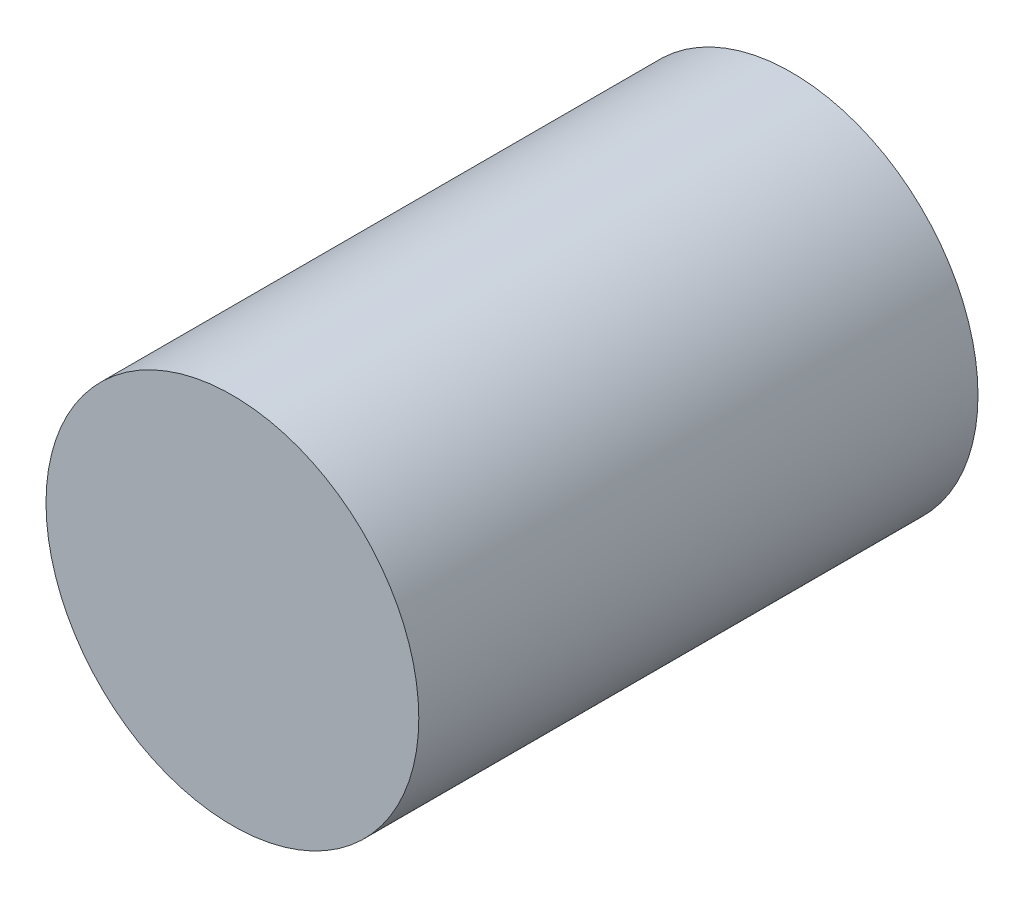
ISO-10303-21;
HEADER;
FILE_DESCRIPTION(('STEP AP214'),'2;1');
FILE_NAME('part.step','',(''),(''),'','','');
FILE_SCHEMA(('AUTOMOTIVE_DESIGN { 1 0 10303 214 1 1 1 1 }'));
ENDSEC;
DATA;
#1=APPLICATION_CONTEXT('core data for automotive mechanical design processes');
#2=APPLICATION_PROTOCOL_DEFINITION('international standard','automotive_design',2000,#1);
#3=PRODUCT_CONTEXT('',#1,'mechanical');
#4=PRODUCT('Part','Part','',(#3));
#5=PRODUCT_RELATED_PRODUCT_CATEGORY('part','',(#4));
#6=PRODUCT_DEFINITION_FORMATION('','',#4);
#7=PRODUCT_DEFINITION_CONTEXT('part definition',#1,'design');
#8=PRODUCT_DEFINITION('design','',#6,#7);
#9=PRODUCT_DEFINITION_SHAPE('','',#8);
#10=(LENGTH_UNIT() NAMED_UNIT(*) SI_UNIT(.MILLI.,.METRE.));
#11=(NAMED_UNIT(*) PLANE_ANGLE_UNIT() SI_UNIT($,.RADIAN.));
#12=(NAMED_UNIT(*) SI_UNIT($,.STERADIAN.) SOLID_ANGLE_UNIT());
#13=UNCERTAINTY_MEASURE_WITH_UNIT(LENGTH_MEASURE(1.E-05),#10,'distance_accuracy_value','');
#14=(GEOMETRIC_REPRESENTATION_CONTEXT(3) GLOBAL_UNCERTAINTY_ASSIGNED_CONTEXT((#13)) GLOBAL_UNIT_ASSIGNED_CONTEXT((#10,
#11,#12)) REPRESENTATION_CONTEXT('',''));
#15=CARTESIAN_POINT('',(0.,0.,0.));
#16=DIRECTION('',(0.,0.,1.));
#17=DIRECTION('',(1.,0.,0.));
#18=AXIS2_PLACEMENT_3D('',#15,#16,#17);
#19=CARTESIAN_POINT('',(0.,0.,300.));
#20=DIRECTION('',(0.,0.,-1.));
#21=DIRECTION('',(-1.,0.,0.));
#22=AXIS2_PLACEMENT_3D('',#19,#20,#21);
#23=CYLINDRICAL_SURFACE('',#22,100.);
#24=CARTESIAN_POINT('',(0.,0.,300.));
#25=DIRECTION('',(0.,0.,1.));
#26=DIRECTION('',(1.,0.,0.));
#27=AXIS2_PLACEMENT_3D('',#24,#25,#26);
#28=CIRCLE('',#27,100.);
#29=CARTESIAN_POINT('',(100.,0.,300.));
#30=VERTEX_POINT('',#29);
#31=EDGE_CURVE('E10',#30,#30,#28,.T.);
#32=ORIENTED_EDGE('',*,*,#31,.F.);
#33=EDGE_LOOP('',(#32));
#34=FACE_BOUND('',#33,.T.);
#35=CARTESIAN_POINT('',(0.,0.,0.));
#36=DIRECTION('',(0.,0.,1.));
#37=DIRECTION('',(1.,0.,0.));
#38=AXIS2_PLACEMENT_3D('',#35,#36,#37);
#39=CIRCLE('',#38,100.);
#40=CARTESIAN_POINT('',(100.,0.,0.));
#41=VERTEX_POINT('',#40);
#42=EDGE_CURVE('E40',#41,#41,#39,.T.);
#43=ORIENTED_EDGE('',*,*,#42,.T.);
#44=EDGE_LOOP('',(#43));
#45=FACE_BOUND('',#44,.T.);
#46=ADVANCED_FACE('F37',(#34,#45),#23,.T.);
#47=CARTESIAN_POINT('',(0.,0.,300.));
#48=DIRECTION('',(0.,0.,1.));
#49=DIRECTION('',(1.,0.,0.));
#50=AXIS2_PLACEMENT_3D('',#47,#48,#49);
#51=PLANE('',#50);
#52=ORIENTED_EDGE('',*,*,#31,.T.);
#53=EDGE_LOOP('',(#52));
#54=FACE_BOUND('',#53,.T.);
#55=ADVANCED_FACE('F54',(#54),#51,.T.);
#56=CARTESIAN_POINT('',(0.,0.,0.));
#57=DIRECTION('',(0.,0.,1.));
#58=DIRECTION('',(1.,0.,0.));
#59=AXIS2_PLACEMENT_3D('',#56,#57,#58);
#60=PLANE('',#59);
#61=ORIENTED_EDGE('',*,*,#42,.F.);
#62=EDGE_LOOP('',(#61));
#63=FACE_BOUND('',#62,.T.);
#64=ADVANCED_FACE('F52',(#63),#60,.F.);
#65=CLOSED_SHELL('',(#46,#55,#64));
#66=MANIFOLD_SOLID_BREP('B2',#65);
#67=ADVANCED_BREP_SHAPE_REPRESENTATION('',(#18,#66),#14);
#68=SHAPE_DEFINITION_REPRESENTATION(#9,#67);
ENDSEC;
END-ISO-10303-21;
